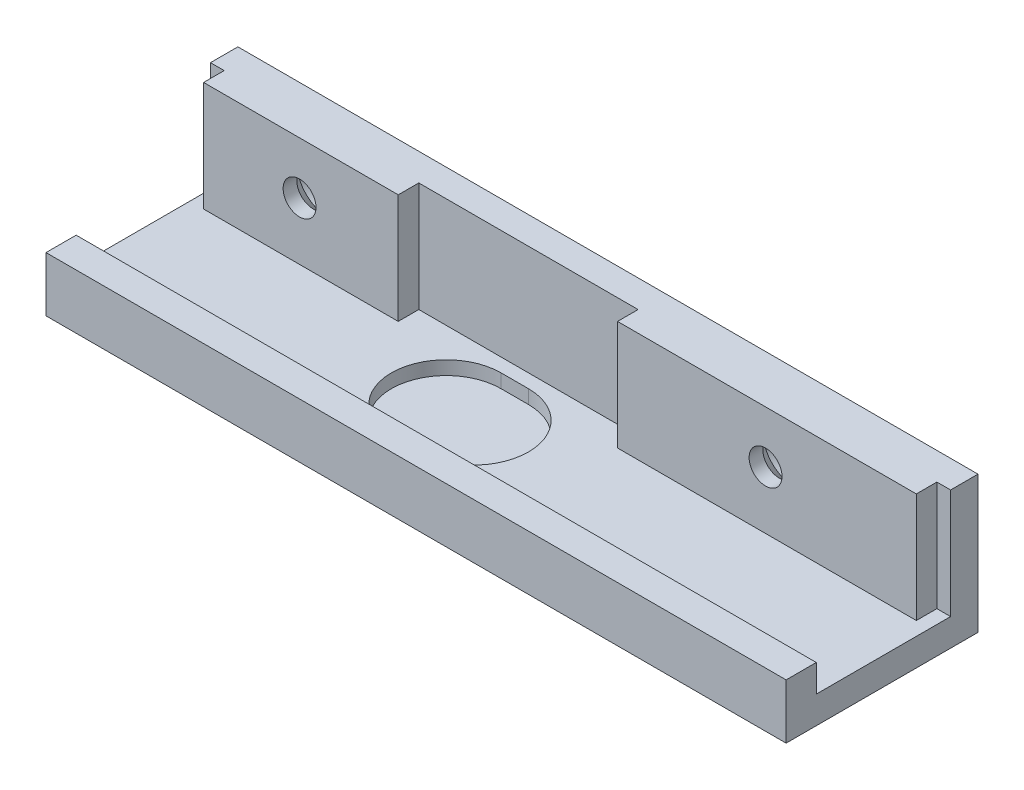
ISO-10303-21;
HEADER;
FILE_DESCRIPTION(('STEP AP214'),'2;1');
FILE_NAME('part.step','',(''),(''),'','','');
FILE_SCHEMA(('AUTOMOTIVE_DESIGN { 1 0 10303 214 1 1 1 1 }'));
ENDSEC;
DATA;
#1=APPLICATION_CONTEXT('core data for automotive mechanical design processes');
#2=APPLICATION_PROTOCOL_DEFINITION('international standard','automotive_design',2000,#1);
#3=PRODUCT_CONTEXT('',#1,'mechanical');
#4=PRODUCT('Part','Part','',(#3));
#5=PRODUCT_RELATED_PRODUCT_CATEGORY('part','',(#4));
#6=PRODUCT_DEFINITION_FORMATION('','',#4);
#7=PRODUCT_DEFINITION_CONTEXT('part definition',#1,'design');
#8=PRODUCT_DEFINITION('design','',#6,#7);
#9=PRODUCT_DEFINITION_SHAPE('','',#8);
#10=(LENGTH_UNIT() NAMED_UNIT(*) SI_UNIT(.MILLI.,.METRE.));
#11=(NAMED_UNIT(*) PLANE_ANGLE_UNIT() SI_UNIT($,.RADIAN.));
#12=(NAMED_UNIT(*) SI_UNIT($,.STERADIAN.) SOLID_ANGLE_UNIT());
#13=UNCERTAINTY_MEASURE_WITH_UNIT(LENGTH_MEASURE(1.E-05),#10,'distance_accuracy_value','');
#14=(GEOMETRIC_REPRESENTATION_CONTEXT(3) GLOBAL_UNCERTAINTY_ASSIGNED_CONTEXT((#13)) GLOBAL_UNIT_ASSIGNED_CONTEXT((#10,
#11,#12)) REPRESENTATION_CONTEXT('',''));
#15=CARTESIAN_POINT('',(0.,0.,0.));
#16=DIRECTION('',(0.,0.,1.));
#17=DIRECTION('',(1.,0.,0.));
#18=AXIS2_PLACEMENT_3D('',#15,#16,#17);
#19=CARTESIAN_POINT('',(0.,2.54,0.));
#20=DIRECTION('',(0.,1.,0.));
#21=DIRECTION('',(0.,0.,1.));
#22=AXIS2_PLACEMENT_3D('',#19,#20,#21);
#23=PLANE('',#22);
#24=DIRECTION('',(-1.,0.,0.));
#25=VECTOR('',#24,1.);
#26=CARTESIAN_POINT('',(0.,2.54,14.986));
#27=LINE('',#26,#25);
#28=CARTESIAN_POINT('',(68.58,2.54,14.986));
#29=VERTEX_POINT('',#28);
#30=CARTESIAN_POINT('',(0.,2.54,14.986));
#31=VERTEX_POINT('',#30);
#32=EDGE_CURVE('E197',#29,#31,#27,.T.);
#33=ORIENTED_EDGE('',*,*,#32,.F.);
#34=DIRECTION('',(0.,0.,-1.));
#35=VECTOR('',#34,1.);
#36=CARTESIAN_POINT('',(68.58,2.54,0.));
#37=LINE('',#36,#35);
#38=CARTESIAN_POINT('',(68.58,2.54,2.54));
#39=VERTEX_POINT('',#38);
#40=EDGE_CURVE('E329',#29,#39,#37,.T.);
#41=ORIENTED_EDGE('',*,*,#40,.T.);
#42=DIRECTION('',(1.,0.,0.));
#43=VECTOR('',#42,1.);
#44=CARTESIAN_POINT('',(67.31,2.54,2.54));
#45=LINE('',#44,#43);
#46=CARTESIAN_POINT('',(67.31,2.54,2.54));
#47=VERTEX_POINT('',#46);
#48=EDGE_CURVE('E56',#47,#39,#45,.T.);
#49=ORIENTED_EDGE('',*,*,#48,.F.);
#50=DIRECTION('',(0.,0.,1.));
#51=VECTOR('',#50,1.);
#52=CARTESIAN_POINT('',(67.31,2.54,2.54));
#53=LINE('',#52,#51);
#54=CARTESIAN_POINT('',(67.31,2.54,4.445));
#55=VERTEX_POINT('',#54);
#56=EDGE_CURVE('E284',#47,#55,#53,.T.);
#57=ORIENTED_EDGE('',*,*,#56,.T.);
#58=DIRECTION('',(1.,0.,0.));
#59=VECTOR('',#58,1.);
#60=CARTESIAN_POINT('',(39.624,2.54,4.445));
#61=LINE('',#60,#59);
#62=CARTESIAN_POINT('',(39.624,2.54,4.445));
#63=VERTEX_POINT('',#62);
#64=EDGE_CURVE('E281',#63,#55,#61,.T.);
#65=ORIENTED_EDGE('',*,*,#64,.F.);
#66=DIRECTION('',(0.,0.,1.));
#67=VECTOR('',#66,1.);
#68=CARTESIAN_POINT('',(39.624,2.54,2.54));
#69=LINE('',#68,#67);
#70=CARTESIAN_POINT('',(39.624,2.54,2.54));
#71=VERTEX_POINT('',#70);
#72=EDGE_CURVE('E278',#71,#63,#69,.T.);
#73=ORIENTED_EDGE('',*,*,#72,.F.);
#74=DIRECTION('',(1.,0.,0.));
#75=VECTOR('',#74,1.);
#76=CARTESIAN_POINT('',(19.304,2.54,2.54));
#77=LINE('',#76,#75);
#78=CARTESIAN_POINT('',(19.304,2.54,2.54));
#79=VERTEX_POINT('',#78);
#80=EDGE_CURVE('E244',#79,#71,#77,.T.);
#81=ORIENTED_EDGE('',*,*,#80,.F.);
#82=DIRECTION('',(0.,0.,1.));
#83=VECTOR('',#82,1.);
#84=CARTESIAN_POINT('',(19.304,2.54,2.54));
#85=LINE('',#84,#83);
#86=CARTESIAN_POINT('',(19.304,2.54,4.445));
#87=VERTEX_POINT('',#86);
#88=EDGE_CURVE('E249',#79,#87,#85,.T.);
#89=ORIENTED_EDGE('',*,*,#88,.T.);
#90=DIRECTION('',(1.,0.,0.));
#91=VECTOR('',#90,1.);
#92=CARTESIAN_POINT('',(1.27,2.54,4.445));
#93=LINE('',#92,#91);
#94=CARTESIAN_POINT('',(1.27,2.54,4.445));
#95=VERTEX_POINT('',#94);
#96=EDGE_CURVE('E293',#95,#87,#93,.T.);
#97=ORIENTED_EDGE('',*,*,#96,.F.);
#98=DIRECTION('',(0.,0.,1.));
#99=VECTOR('',#98,1.);
#100=CARTESIAN_POINT('',(1.27,2.54,2.54));
#101=LINE('',#100,#99);
#102=CARTESIAN_POINT('',(1.27,2.54,2.54));
#103=VERTEX_POINT('',#102);
#104=EDGE_CURVE('E290',#103,#95,#101,.T.);
#105=ORIENTED_EDGE('',*,*,#104,.F.);
#106=DIRECTION('',(1.,0.,0.));
#107=VECTOR('',#106,1.);
#108=CARTESIAN_POINT('',(0.,2.54,2.54));
#109=LINE('',#108,#107);
#110=CARTESIAN_POINT('',(0.,2.54,2.54));
#111=VERTEX_POINT('',#110);
#112=EDGE_CURVE('E287',#111,#103,#109,.T.);
#113=ORIENTED_EDGE('',*,*,#112,.F.);
#114=DIRECTION('',(0.,0.,1.));
#115=VECTOR('',#114,1.);
#116=CARTESIAN_POINT('',(0.,2.54,0.));
#117=LINE('',#116,#115);
#118=EDGE_CURVE('E327',#111,#31,#117,.T.);
#119=ORIENTED_EDGE('',*,*,#118,.T.);
#120=EDGE_LOOP('',(#33,#41,#49,#57,#65,#73,#81,#89,#97,#105,#113,#119));
#121=FACE_BOUND('',#120,.T.);
#122=CARTESIAN_POINT('',(28.194,2.54,8.89));
#123=DIRECTION('',(0.,1.,0.));
#124=DIRECTION('',(0.,0.,1.));
#125=AXIS2_PLACEMENT_3D('',#122,#123,#124);
#126=CIRCLE('',#125,5.08);
#127=CARTESIAN_POINT('',(28.194,2.54,3.81));
#128=VERTEX_POINT('',#127);
#129=CARTESIAN_POINT('',(28.194,2.54,13.97));
#130=VERTEX_POINT('',#129);
#131=EDGE_CURVE('E48',#128,#130,#126,.T.);
#132=ORIENTED_EDGE('',*,*,#131,.F.);
#133=DIRECTION('',(-1.,0.,0.));
#134=VECTOR('',#133,1.);
#135=CARTESIAN_POINT('',(28.194,2.54,3.81));
#136=LINE('',#135,#134);
#137=CARTESIAN_POINT('',(30.734,2.54,3.81));
#138=VERTEX_POINT('',#137);
#139=EDGE_CURVE('E206',#138,#128,#136,.T.);
#140=ORIENTED_EDGE('',*,*,#139,.F.);
#141=CARTESIAN_POINT('',(30.734,2.54,8.89));
#142=DIRECTION('',(0.,1.,0.));
#143=DIRECTION('',(0.,0.,1.));
#144=AXIS2_PLACEMENT_3D('',#141,#142,#143);
#145=CIRCLE('',#144,5.08);
#146=CARTESIAN_POINT('',(30.734,2.54,13.97));
#147=VERTEX_POINT('',#146);
#148=EDGE_CURVE('E220',#147,#138,#145,.T.);
#149=ORIENTED_EDGE('',*,*,#148,.F.);
#150=DIRECTION('',(1.,0.,0.));
#151=VECTOR('',#150,1.);
#152=CARTESIAN_POINT('',(28.194,2.54,13.97));
#153=LINE('',#152,#151);
#154=EDGE_CURVE('E217',#130,#147,#153,.T.);
#155=ORIENTED_EDGE('',*,*,#154,.F.);
#156=EDGE_LOOP('',(#132,#140,#149,#155));
#157=FACE_BOUND('',#156,.T.);
#158=ADVANCED_FACE('F33',(#121,#157),#23,.T.);
#159=CARTESIAN_POINT('',(0.,2.54,0.));
#160=DIRECTION('',(1.,0.,0.));
#161=DIRECTION('',(0.,0.,-1.));
#162=AXIS2_PLACEMENT_3D('',#159,#160,#161);
#163=PLANE('',#162);
#164=DIRECTION('',(0.,0.,1.));
#165=VECTOR('',#164,1.);
#166=CARTESIAN_POINT('',(0.,0.,0.));
#167=LINE('',#166,#165);
#168=CARTESIAN_POINT('',(0.,0.,0.));
#169=VERTEX_POINT('',#168);
#170=CARTESIAN_POINT('',(0.,0.,17.78));
#171=VERTEX_POINT('',#170);
#172=EDGE_CURVE('E326',#169,#171,#167,.T.);
#173=ORIENTED_EDGE('',*,*,#172,.T.);
#174=DIRECTION('',(0.,-1.,0.));
#175=VECTOR('',#174,1.);
#176=CARTESIAN_POINT('',(0.,2.54,17.78));
#177=LINE('',#176,#175);
#178=CARTESIAN_POINT('',(0.,5.08,17.78));
#179=VERTEX_POINT('',#178);
#180=EDGE_CURVE('E179',#179,#171,#177,.T.);
#181=ORIENTED_EDGE('',*,*,#180,.F.);
#182=DIRECTION('',(0.,0.,1.));
#183=VECTOR('',#182,1.);
#184=CARTESIAN_POINT('',(0.,5.08,17.78));
#185=LINE('',#184,#183);
#186=CARTESIAN_POINT('',(0.,5.08,14.986));
#187=VERTEX_POINT('',#186);
#188=EDGE_CURVE('E170',#187,#179,#185,.T.);
#189=ORIENTED_EDGE('',*,*,#188,.F.);
#190=DIRECTION('',(0.,1.,0.));
#191=VECTOR('',#190,1.);
#192=CARTESIAN_POINT('',(0.,2.54,14.986));
#193=LINE('',#192,#191);
#194=EDGE_CURVE('E176',#31,#187,#193,.T.);
#195=ORIENTED_EDGE('',*,*,#194,.F.);
#196=ORIENTED_EDGE('',*,*,#118,.F.);
#197=DIRECTION('',(0.,-1.,0.));
#198=VECTOR('',#197,1.);
#199=CARTESIAN_POINT('',(0.,12.7,2.54));
#200=LINE('',#199,#198);
#201=CARTESIAN_POINT('',(0.,12.7,2.54));
#202=VERTEX_POINT('',#201);
#203=EDGE_CURVE('E308',#202,#111,#200,.T.);
#204=ORIENTED_EDGE('',*,*,#203,.F.);
#205=DIRECTION('',(0.,0.,1.));
#206=VECTOR('',#205,1.);
#207=CARTESIAN_POINT('',(0.,12.7,0.));
#208=LINE('',#207,#206);
#209=CARTESIAN_POINT('',(0.,12.7,0.));
#210=VERTEX_POINT('',#209);
#211=EDGE_CURVE('E264',#210,#202,#208,.T.);
#212=ORIENTED_EDGE('',*,*,#211,.F.);
#213=DIRECTION('',(0.,-1.,0.));
#214=VECTOR('',#213,1.);
#215=CARTESIAN_POINT('',(0.,2.54,0.));
#216=LINE('',#215,#214);
#217=EDGE_CURVE('E332',#210,#169,#216,.T.);
#218=ORIENTED_EDGE('',*,*,#217,.T.);
#219=EDGE_LOOP('',(#173,#181,#189,#195,#196,#204,#212,#218));
#220=FACE_BOUND('',#219,.T.);
#221=ADVANCED_FACE('F173',(#220),#163,.F.);
#222=CARTESIAN_POINT('',(0.,2.54,17.78));
#223=DIRECTION('',(0.,0.,-1.));
#224=DIRECTION('',(-1.,0.,0.));
#225=AXIS2_PLACEMENT_3D('',#222,#223,#224);
#226=PLANE('',#225);
#227=DIRECTION('',(1.,0.,0.));
#228=VECTOR('',#227,1.);
#229=CARTESIAN_POINT('',(0.,0.,17.78));
#230=LINE('',#229,#228);
#231=CARTESIAN_POINT('',(68.58,0.,17.78));
#232=VERTEX_POINT('',#231);
#233=EDGE_CURVE('E334',#171,#232,#230,.T.);
#234=ORIENTED_EDGE('',*,*,#233,.T.);
#235=DIRECTION('',(0.,-1.,0.));
#236=VECTOR('',#235,1.);
#237=CARTESIAN_POINT('',(68.58,2.54,17.78));
#238=LINE('',#237,#236);
#239=CARTESIAN_POINT('',(68.58,5.08,17.78));
#240=VERTEX_POINT('',#239);
#241=EDGE_CURVE('E344',#240,#232,#238,.T.);
#242=ORIENTED_EDGE('',*,*,#241,.F.);
#243=DIRECTION('',(1.,0.,0.));
#244=VECTOR('',#243,1.);
#245=CARTESIAN_POINT('',(0.,5.08,17.78));
#246=LINE('',#245,#244);
#247=EDGE_CURVE('E183',#179,#240,#246,.T.);
#248=ORIENTED_EDGE('',*,*,#247,.F.);
#249=ORIENTED_EDGE('',*,*,#180,.T.);
#250=EDGE_LOOP('',(#234,#242,#248,#249));
#251=FACE_BOUND('',#250,.T.);
#252=ADVANCED_FACE('F427',(#251),#226,.F.);
#253=CARTESIAN_POINT('',(68.58,2.54,0.));
#254=DIRECTION('',(-1.,0.,0.));
#255=DIRECTION('',(0.,0.,1.));
#256=AXIS2_PLACEMENT_3D('',#253,#254,#255);
#257=PLANE('',#256);
#258=ORIENTED_EDGE('',*,*,#40,.F.);
#259=DIRECTION('',(0.,-1.,0.));
#260=VECTOR('',#259,1.);
#261=CARTESIAN_POINT('',(68.58,2.54,14.986));
#262=LINE('',#261,#260);
#263=CARTESIAN_POINT('',(68.58,5.08,14.986));
#264=VERTEX_POINT('',#263);
#265=EDGE_CURVE('E193',#264,#29,#262,.T.);
#266=ORIENTED_EDGE('',*,*,#265,.F.);
#267=DIRECTION('',(0.,0.,-1.));
#268=VECTOR('',#267,1.);
#269=CARTESIAN_POINT('',(68.58,5.08,17.78));
#270=LINE('',#269,#268);
#271=EDGE_CURVE('E190',#240,#264,#270,.T.);
#272=ORIENTED_EDGE('',*,*,#271,.F.);
#273=ORIENTED_EDGE('',*,*,#241,.T.);
#274=DIRECTION('',(0.,0.,-1.));
#275=VECTOR('',#274,1.);
#276=CARTESIAN_POINT('',(68.58,0.,0.));
#277=LINE('',#276,#275);
#278=CARTESIAN_POINT('',(68.58,0.,0.));
#279=VERTEX_POINT('',#278);
#280=EDGE_CURVE('E336',#232,#279,#277,.T.);
#281=ORIENTED_EDGE('',*,*,#280,.T.);
#282=DIRECTION('',(0.,-1.,0.));
#283=VECTOR('',#282,1.);
#284=CARTESIAN_POINT('',(68.58,2.54,0.));
#285=LINE('',#284,#283);
#286=CARTESIAN_POINT('',(68.58,12.7,0.));
#287=VERTEX_POINT('',#286);
#288=EDGE_CURVE('E341',#287,#279,#285,.T.);
#289=ORIENTED_EDGE('',*,*,#288,.F.);
#290=DIRECTION('',(0.,0.,1.));
#291=VECTOR('',#290,1.);
#292=CARTESIAN_POINT('',(68.58,12.7,0.));
#293=LINE('',#292,#291);
#294=CARTESIAN_POINT('',(68.58,12.7,2.54));
#295=VERTEX_POINT('',#294);
#296=EDGE_CURVE('E258',#287,#295,#293,.T.);
#297=ORIENTED_EDGE('',*,*,#296,.T.);
#298=DIRECTION('',(0.,-1.,0.));
#299=VECTOR('',#298,1.);
#300=CARTESIAN_POINT('',(68.58,12.7,2.54));
#301=LINE('',#300,#299);
#302=EDGE_CURVE('E311',#295,#39,#301,.T.);
#303=ORIENTED_EDGE('',*,*,#302,.T.);
#304=EDGE_LOOP('',(#258,#266,#272,#273,#281,#289,#297,#303));
#305=FACE_BOUND('',#304,.T.);
#306=ADVANCED_FACE('F409',(#305),#257,.F.);
#307=CARTESIAN_POINT('',(0.,2.54,0.));
#308=DIRECTION('',(0.,0.,1.));
#309=DIRECTION('',(1.,0.,0.));
#310=AXIS2_PLACEMENT_3D('',#307,#308,#309);
#311=PLANE('',#310);
#312=CARTESIAN_POINT('',(53.34,7.874,0.));
#313=DIRECTION('',(0.,0.,1.));
#314=DIRECTION('',(1.,0.,0.));
#315=AXIS2_PLACEMENT_3D('',#312,#313,#314);
#316=CIRCLE('',#315,2.921);
#317=CARTESIAN_POINT('',(56.261,7.874,0.));
#318=VERTEX_POINT('',#317);
#319=EDGE_CURVE('E227',#318,#318,#316,.T.);
#320=ORIENTED_EDGE('',*,*,#319,.T.);
#321=EDGE_LOOP('',(#320));
#322=FACE_BOUND('',#321,.T.);
#323=CARTESIAN_POINT('',(10.16,7.874,0.));
#324=DIRECTION('',(0.,0.,1.));
#325=DIRECTION('',(1.,0.,0.));
#326=AXIS2_PLACEMENT_3D('',#323,#324,#325);
#327=CIRCLE('',#326,2.921);
#328=CARTESIAN_POINT('',(13.081,7.874,0.));
#329=VERTEX_POINT('',#328);
#330=EDGE_CURVE('E235',#329,#329,#327,.T.);
#331=ORIENTED_EDGE('',*,*,#330,.T.);
#332=EDGE_LOOP('',(#331));
#333=FACE_BOUND('',#332,.T.);
#334=DIRECTION('',(-1.,0.,0.));
#335=VECTOR('',#334,1.);
#336=CARTESIAN_POINT('',(0.,0.,0.));
#337=LINE('',#336,#335);
#338=EDGE_CURVE('E330',#279,#169,#337,.T.);
#339=ORIENTED_EDGE('',*,*,#338,.T.);
#340=ORIENTED_EDGE('',*,*,#217,.F.);
#341=DIRECTION('',(1.,0.,0.));
#342=VECTOR('',#341,1.);
#343=CARTESIAN_POINT('',(0.,12.7,0.));
#344=LINE('',#343,#342);
#345=EDGE_CURVE('E261',#210,#287,#344,.T.);
#346=ORIENTED_EDGE('',*,*,#345,.T.);
#347=ORIENTED_EDGE('',*,*,#288,.T.);
#348=EDGE_LOOP('',(#339,#340,#346,#347));
#349=FACE_BOUND('',#348,.T.);
#350=ADVANCED_FACE('F420',(#322,#333,#349),#311,.F.);
#351=CARTESIAN_POINT('',(0.,0.,0.));
#352=DIRECTION('',(0.,1.,0.));
#353=DIRECTION('',(0.,0.,1.));
#354=AXIS2_PLACEMENT_3D('',#351,#352,#353);
#355=PLANE('',#354);
#356=ORIENTED_EDGE('',*,*,#172,.F.);
#357=ORIENTED_EDGE('',*,*,#338,.F.);
#358=ORIENTED_EDGE('',*,*,#280,.F.);
#359=ORIENTED_EDGE('',*,*,#233,.F.);
#360=EDGE_LOOP('',(#356,#357,#358,#359));
#361=FACE_BOUND('',#360,.T.);
#362=ADVANCED_FACE('F424',(#361),#355,.F.);
#363=CARTESIAN_POINT('',(0.,5.08,0.));
#364=DIRECTION('',(0.,-1.,0.));
#365=DIRECTION('',(0.,0.,-1.));
#366=AXIS2_PLACEMENT_3D('',#363,#364,#365);
#367=PLANE('',#366);
#368=ORIENTED_EDGE('',*,*,#188,.T.);
#369=ORIENTED_EDGE('',*,*,#247,.T.);
#370=ORIENTED_EDGE('',*,*,#271,.T.);
#371=DIRECTION('',(1.,0.,0.));
#372=VECTOR('',#371,1.);
#373=CARTESIAN_POINT('',(0.,5.08,14.986));
#374=LINE('',#373,#372);
#375=EDGE_CURVE('E187',#187,#264,#374,.T.);
#376=ORIENTED_EDGE('',*,*,#375,.F.);
#377=EDGE_LOOP('',(#368,#369,#370,#376));
#378=FACE_BOUND('',#377,.T.);
#379=ADVANCED_FACE('F188',(#378),#367,.F.);
#380=CARTESIAN_POINT('',(19.304,12.7,2.54));
#381=DIRECTION('',(0.,0.,-1.));
#382=DIRECTION('',(-1.,0.,0.));
#383=AXIS2_PLACEMENT_3D('',#380,#381,#382);
#384=PLANE('',#383);
#385=ORIENTED_EDGE('',*,*,#80,.T.);
#386=DIRECTION('',(0.,-1.,0.));
#387=VECTOR('',#386,1.);
#388=CARTESIAN_POINT('',(39.624,12.7,2.54));
#389=LINE('',#388,#387);
#390=CARTESIAN_POINT('',(39.624,12.7,2.54));
#391=VERTEX_POINT('',#390);
#392=EDGE_CURVE('E184',#391,#71,#389,.T.);
#393=ORIENTED_EDGE('',*,*,#392,.F.);
#394=DIRECTION('',(1.,0.,0.));
#395=VECTOR('',#394,1.);
#396=CARTESIAN_POINT('',(19.304,12.7,2.54));
#397=LINE('',#396,#395);
#398=CARTESIAN_POINT('',(19.304,12.7,2.54));
#399=VERTEX_POINT('',#398);
#400=EDGE_CURVE('E245',#399,#391,#397,.T.);
#401=ORIENTED_EDGE('',*,*,#400,.F.);
#402=DIRECTION('',(0.,-1.,0.));
#403=VECTOR('',#402,1.);
#404=CARTESIAN_POINT('',(19.304,12.7,2.54));
#405=LINE('',#404,#403);
#406=EDGE_CURVE('E275',#399,#79,#405,.T.);
#407=ORIENTED_EDGE('',*,*,#406,.T.);
#408=EDGE_LOOP('',(#385,#393,#401,#407));
#409=FACE_BOUND('',#408,.T.);
#410=ADVANCED_FACE('F387',(#409),#384,.F.);
#411=CARTESIAN_POINT('',(39.624,12.7,2.54));
#412=DIRECTION('',(1.,0.,0.));
#413=DIRECTION('',(0.,0.,-1.));
#414=AXIS2_PLACEMENT_3D('',#411,#412,#413);
#415=PLANE('',#414);
#416=ORIENTED_EDGE('',*,*,#72,.T.);
#417=DIRECTION('',(0.,-1.,0.));
#418=VECTOR('',#417,1.);
#419=CARTESIAN_POINT('',(39.624,12.7,4.445));
#420=LINE('',#419,#418);
#421=CARTESIAN_POINT('',(39.624,12.7,4.445));
#422=VERTEX_POINT('',#421);
#423=EDGE_CURVE('E319',#422,#63,#420,.T.);
#424=ORIENTED_EDGE('',*,*,#423,.F.);
#425=DIRECTION('',(0.,0.,1.));
#426=VECTOR('',#425,1.);
#427=CARTESIAN_POINT('',(39.624,12.7,2.54));
#428=LINE('',#427,#426);
#429=EDGE_CURVE('E248',#391,#422,#428,.T.);
#430=ORIENTED_EDGE('',*,*,#429,.F.);
#431=ORIENTED_EDGE('',*,*,#392,.T.);
#432=EDGE_LOOP('',(#416,#424,#430,#431));
#433=FACE_BOUND('',#432,.T.);
#434=ADVANCED_FACE('F376',(#433),#415,.F.);
#435=CARTESIAN_POINT('',(39.624,12.7,4.445));
#436=DIRECTION('',(0.,0.,-1.));
#437=DIRECTION('',(-1.,0.,0.));
#438=AXIS2_PLACEMENT_3D('',#435,#436,#437);
#439=PLANE('',#438);
#440=CARTESIAN_POINT('',(53.34,7.874,4.445));
#441=DIRECTION('',(0.,0.,1.));
#442=DIRECTION('',(1.,0.,0.));
#443=AXIS2_PLACEMENT_3D('',#440,#441,#442);
#444=CIRCLE('',#443,1.524);
#445=CARTESIAN_POINT('',(54.864,7.874,4.445));
#446=VERTEX_POINT('',#445);
#447=EDGE_CURVE('E238',#446,#446,#444,.T.);
#448=ORIENTED_EDGE('',*,*,#447,.F.);
#449=EDGE_LOOP('',(#448));
#450=FACE_BOUND('',#449,.T.);
#451=ORIENTED_EDGE('',*,*,#64,.T.);
#452=DIRECTION('',(0.,-1.,0.));
#453=VECTOR('',#452,1.);
#454=CARTESIAN_POINT('',(67.31,12.7,4.445));
#455=LINE('',#454,#453);
#456=CARTESIAN_POINT('',(67.31,12.7,4.445));
#457=VERTEX_POINT('',#456);
#458=EDGE_CURVE('E316',#457,#55,#455,.T.);
#459=ORIENTED_EDGE('',*,*,#458,.F.);
#460=DIRECTION('',(1.,0.,0.));
#461=VECTOR('',#460,1.);
#462=CARTESIAN_POINT('',(39.624,12.7,4.445));
#463=LINE('',#462,#461);
#464=EDGE_CURVE('E251',#422,#457,#463,.T.);
#465=ORIENTED_EDGE('',*,*,#464,.F.);
#466=ORIENTED_EDGE('',*,*,#423,.T.);
#467=EDGE_LOOP('',(#451,#459,#465,#466));
#468=FACE_BOUND('',#467,.T.);
#469=ADVANCED_FACE('F372',(#450,#468),#439,.F.);
#470=CARTESIAN_POINT('',(67.31,12.7,2.54));
#471=DIRECTION('',(1.,0.,0.));
#472=DIRECTION('',(0.,0.,-1.));
#473=AXIS2_PLACEMENT_3D('',#470,#471,#472);
#474=PLANE('',#473);
#475=ORIENTED_EDGE('',*,*,#56,.F.);
#476=DIRECTION('',(0.,-1.,0.));
#477=VECTOR('',#476,1.);
#478=CARTESIAN_POINT('',(67.31,12.7,2.54));
#479=LINE('',#478,#477);
#480=CARTESIAN_POINT('',(67.31,12.7,2.54));
#481=VERTEX_POINT('',#480);
#482=EDGE_CURVE('E314',#481,#47,#479,.T.);
#483=ORIENTED_EDGE('',*,*,#482,.F.);
#484=DIRECTION('',(0.,0.,1.));
#485=VECTOR('',#484,1.);
#486=CARTESIAN_POINT('',(67.31,12.7,2.54));
#487=LINE('',#486,#485);
#488=EDGE_CURVE('E253',#481,#457,#487,.T.);
#489=ORIENTED_EDGE('',*,*,#488,.T.);
#490=ORIENTED_EDGE('',*,*,#458,.T.);
#491=EDGE_LOOP('',(#475,#483,#489,#490));
#492=FACE_BOUND('',#491,.T.);
#493=ADVANCED_FACE('F375',(#492),#474,.T.);
#494=CARTESIAN_POINT('',(67.31,12.7,2.54));
#495=DIRECTION('',(0.,0.,-1.));
#496=DIRECTION('',(-1.,0.,0.));
#497=AXIS2_PLACEMENT_3D('',#494,#495,#496);
#498=PLANE('',#497);
#499=ORIENTED_EDGE('',*,*,#48,.T.);
#500=ORIENTED_EDGE('',*,*,#302,.F.);
#501=DIRECTION('',(1.,0.,0.));
#502=VECTOR('',#501,1.);
#503=CARTESIAN_POINT('',(67.31,12.7,2.54));
#504=LINE('',#503,#502);
#505=EDGE_CURVE('E256',#481,#295,#504,.T.);
#506=ORIENTED_EDGE('',*,*,#505,.F.);
#507=ORIENTED_EDGE('',*,*,#482,.T.);
#508=EDGE_LOOP('',(#499,#500,#506,#507));
#509=FACE_BOUND('',#508,.T.);
#510=ADVANCED_FACE('F414',(#509),#498,.F.);
#511=CARTESIAN_POINT('',(0.,12.7,2.54));
#512=DIRECTION('',(0.,0.,-1.));
#513=DIRECTION('',(-1.,0.,0.));
#514=AXIS2_PLACEMENT_3D('',#511,#512,#513);
#515=PLANE('',#514);
#516=ORIENTED_EDGE('',*,*,#112,.T.);
#517=DIRECTION('',(0.,-1.,0.));
#518=VECTOR('',#517,1.);
#519=CARTESIAN_POINT('',(1.27,12.7,2.54));
#520=LINE('',#519,#518);
#521=CARTESIAN_POINT('',(1.27,12.7,2.54));
#522=VERTEX_POINT('',#521);
#523=EDGE_CURVE('E305',#522,#103,#520,.T.);
#524=ORIENTED_EDGE('',*,*,#523,.F.);
#525=DIRECTION('',(1.,0.,0.));
#526=VECTOR('',#525,1.);
#527=CARTESIAN_POINT('',(0.,12.7,2.54));
#528=LINE('',#527,#526);
#529=EDGE_CURVE('E266',#202,#522,#528,.T.);
#530=ORIENTED_EDGE('',*,*,#529,.F.);
#531=ORIENTED_EDGE('',*,*,#203,.T.);
#532=EDGE_LOOP('',(#516,#524,#530,#531));
#533=FACE_BOUND('',#532,.T.);
#534=ADVANCED_FACE('F402',(#533),#515,.F.);
#535=CARTESIAN_POINT('',(1.27,12.7,2.54));
#536=DIRECTION('',(1.,0.,0.));
#537=DIRECTION('',(0.,0.,-1.));
#538=AXIS2_PLACEMENT_3D('',#535,#536,#537);
#539=PLANE('',#538);
#540=ORIENTED_EDGE('',*,*,#104,.T.);
#541=DIRECTION('',(0.,-1.,0.));
#542=VECTOR('',#541,1.);
#543=CARTESIAN_POINT('',(1.27,12.7,4.445));
#544=LINE('',#543,#542);
#545=CARTESIAN_POINT('',(1.27,12.7,4.445));
#546=VERTEX_POINT('',#545);
#547=EDGE_CURVE('E302',#546,#95,#544,.T.);
#548=ORIENTED_EDGE('',*,*,#547,.F.);
#549=DIRECTION('',(0.,0.,1.));
#550=VECTOR('',#549,1.);
#551=CARTESIAN_POINT('',(1.27,12.7,2.54));
#552=LINE('',#551,#550);
#553=EDGE_CURVE('E268',#522,#546,#552,.T.);
#554=ORIENTED_EDGE('',*,*,#553,.F.);
#555=ORIENTED_EDGE('',*,*,#523,.T.);
#556=EDGE_LOOP('',(#540,#548,#554,#555));
#557=FACE_BOUND('',#556,.T.);
#558=ADVANCED_FACE('F399',(#557),#539,.F.);
#559=CARTESIAN_POINT('',(1.27,12.7,4.445));
#560=DIRECTION('',(0.,0.,-1.));
#561=DIRECTION('',(-1.,0.,0.));
#562=AXIS2_PLACEMENT_3D('',#559,#560,#561);
#563=PLANE('',#562);
#564=CARTESIAN_POINT('',(10.16,7.874,4.445));
#565=DIRECTION('',(0.,0.,1.));
#566=DIRECTION('',(1.,0.,0.));
#567=AXIS2_PLACEMENT_3D('',#564,#565,#566);
#568=CIRCLE('',#567,1.524);
#569=CARTESIAN_POINT('',(11.684,7.874,4.445));
#570=VERTEX_POINT('',#569);
#571=EDGE_CURVE('E241',#570,#570,#568,.T.);
#572=ORIENTED_EDGE('',*,*,#571,.F.);
#573=EDGE_LOOP('',(#572));
#574=FACE_BOUND('',#573,.T.);
#575=ORIENTED_EDGE('',*,*,#96,.T.);
#576=DIRECTION('',(0.,-1.,0.));
#577=VECTOR('',#576,1.);
#578=CARTESIAN_POINT('',(19.304,12.7,4.445));
#579=LINE('',#578,#577);
#580=CARTESIAN_POINT('',(19.304,12.7,4.445));
#581=VERTEX_POINT('',#580);
#582=EDGE_CURVE('E299',#581,#87,#579,.T.);
#583=ORIENTED_EDGE('',*,*,#582,.F.);
#584=DIRECTION('',(1.,0.,0.));
#585=VECTOR('',#584,1.);
#586=CARTESIAN_POINT('',(1.27,12.7,4.445));
#587=LINE('',#586,#585);
#588=EDGE_CURVE('E270',#546,#581,#587,.T.);
#589=ORIENTED_EDGE('',*,*,#588,.F.);
#590=ORIENTED_EDGE('',*,*,#547,.T.);
#591=EDGE_LOOP('',(#575,#583,#589,#590));
#592=FACE_BOUND('',#591,.T.);
#593=ADVANCED_FACE('F395',(#574,#592),#563,.F.);
#594=CARTESIAN_POINT('',(19.304,12.7,2.54));
#595=DIRECTION('',(1.,0.,0.));
#596=DIRECTION('',(0.,0.,-1.));
#597=AXIS2_PLACEMENT_3D('',#594,#595,#596);
#598=PLANE('',#597);
#599=ORIENTED_EDGE('',*,*,#88,.F.);
#600=ORIENTED_EDGE('',*,*,#406,.F.);
#601=DIRECTION('',(0.,0.,1.));
#602=VECTOR('',#601,1.);
#603=CARTESIAN_POINT('',(19.304,12.7,2.54));
#604=LINE('',#603,#602);
#605=EDGE_CURVE('E272',#399,#581,#604,.T.);
#606=ORIENTED_EDGE('',*,*,#605,.T.);
#607=ORIENTED_EDGE('',*,*,#582,.T.);
#608=EDGE_LOOP('',(#599,#600,#606,#607));
#609=FACE_BOUND('',#608,.T.);
#610=ADVANCED_FACE('F391',(#609),#598,.T.);
#611=CARTESIAN_POINT('',(0.,12.7,0.));
#612=DIRECTION('',(0.,-1.,0.));
#613=DIRECTION('',(0.,0.,-1.));
#614=AXIS2_PLACEMENT_3D('',#611,#612,#613);
#615=PLANE('',#614);
#616=ORIENTED_EDGE('',*,*,#400,.T.);
#617=ORIENTED_EDGE('',*,*,#429,.T.);
#618=ORIENTED_EDGE('',*,*,#464,.T.);
#619=ORIENTED_EDGE('',*,*,#488,.F.);
#620=ORIENTED_EDGE('',*,*,#505,.T.);
#621=ORIENTED_EDGE('',*,*,#296,.F.);
#622=ORIENTED_EDGE('',*,*,#345,.F.);
#623=ORIENTED_EDGE('',*,*,#211,.T.);
#624=ORIENTED_EDGE('',*,*,#529,.T.);
#625=ORIENTED_EDGE('',*,*,#553,.T.);
#626=ORIENTED_EDGE('',*,*,#588,.T.);
#627=ORIENTED_EDGE('',*,*,#605,.F.);
#628=EDGE_LOOP('',(#616,#617,#618,#619,#620,#621,#622,#623,#624,#625,#626,#627));
#629=FACE_BOUND('',#628,.T.);
#630=ADVANCED_FACE('F418',(#629),#615,.F.);
#631=CARTESIAN_POINT('',(10.16,7.874,0.));
#632=DIRECTION('',(0.,0.,1.));
#633=DIRECTION('',(1.,0.,0.));
#634=AXIS2_PLACEMENT_3D('',#631,#632,#633);
#635=CYLINDRICAL_SURFACE('',#634,1.524);
#636=CARTESIAN_POINT('',(10.16,7.874,3.17500000000004));
#637=DIRECTION('',(0.,0.,1.));
#638=DIRECTION('',(1.,0.,0.));
#639=AXIS2_PLACEMENT_3D('',#636,#637,#638);
#640=CIRCLE('',#639,1.524);
#641=CARTESIAN_POINT('',(11.684,7.874,3.17500000000004));
#642=VERTEX_POINT('',#641);
#643=EDGE_CURVE('E351',#642,#642,#640,.F.);
#644=ORIENTED_EDGE('',*,*,#643,.T.);
#645=EDGE_LOOP('',(#644));
#646=FACE_BOUND('',#645,.T.);
#647=ORIENTED_EDGE('',*,*,#571,.T.);
#648=EDGE_LOOP('',(#647));
#649=FACE_BOUND('',#648,.T.);
#650=ADVANCED_FACE('F368',(#646,#649),#635,.F.);
#651=CARTESIAN_POINT('',(53.34,7.874,0.));
#652=DIRECTION('',(0.,0.,1.));
#653=DIRECTION('',(1.,0.,0.));
#654=AXIS2_PLACEMENT_3D('',#651,#652,#653);
#655=CYLINDRICAL_SURFACE('',#654,1.524);
#656=CARTESIAN_POINT('',(53.34,7.874,3.17500000000004));
#657=DIRECTION('',(0.,0.,1.));
#658=DIRECTION('',(1.,0.,0.));
#659=AXIS2_PLACEMENT_3D('',#656,#657,#658);
#660=CIRCLE('',#659,1.524);
#661=CARTESIAN_POINT('',(54.864,7.874,3.17500000000004));
#662=VERTEX_POINT('',#661);
#663=EDGE_CURVE('E348',#662,#662,#660,.F.);
#664=ORIENTED_EDGE('',*,*,#663,.T.);
#665=EDGE_LOOP('',(#664));
#666=FACE_BOUND('',#665,.T.);
#667=ORIENTED_EDGE('',*,*,#447,.T.);
#668=EDGE_LOOP('',(#667));
#669=FACE_BOUND('',#668,.T.);
#670=ADVANCED_FACE('F364',(#666,#669),#655,.F.);
#671=CARTESIAN_POINT('',(10.16,7.874,0.));
#672=DIRECTION('',(0.,0.,1.));
#673=DIRECTION('',(1.,0.,0.));
#674=AXIS2_PLACEMENT_3D('',#671,#672,#673);
#675=CYLINDRICAL_SURFACE('',#674,2.921);
#676=CARTESIAN_POINT('',(10.16,7.874,1.77800000000003));
#677=DIRECTION('',(0.,0.,-1.));
#678=DIRECTION('',(-1.,0.,0.));
#679=AXIS2_PLACEMENT_3D('',#676,#677,#678);
#680=CIRCLE('',#679,2.921);
#681=CARTESIAN_POINT('',(7.239,7.874,1.77800000000003));
#682=VERTEX_POINT('',#681);
#683=EDGE_CURVE('E11',#682,#682,#680,.F.);
#684=ORIENTED_EDGE('',*,*,#683,.T.);
#685=EDGE_LOOP('',(#684));
#686=FACE_BOUND('',#685,.T.);
#687=ORIENTED_EDGE('',*,*,#330,.F.);
#688=EDGE_LOOP('',(#687));
#689=FACE_BOUND('',#688,.T.);
#690=ADVANCED_FACE('F367',(#686,#689),#675,.F.);
#691=CARTESIAN_POINT('',(53.34,7.874,0.));
#692=DIRECTION('',(0.,0.,1.));
#693=DIRECTION('',(1.,0.,0.));
#694=AXIS2_PLACEMENT_3D('',#691,#692,#693);
#695=CYLINDRICAL_SURFACE('',#694,2.921);
#696=CARTESIAN_POINT('',(53.34,7.874,1.77800000000003));
#697=DIRECTION('',(0.,0.,-1.));
#698=DIRECTION('',(-1.,0.,0.));
#699=AXIS2_PLACEMENT_3D('',#696,#697,#698);
#700=CIRCLE('',#699,2.921);
#701=CARTESIAN_POINT('',(50.419,7.874,1.77800000000003));
#702=VERTEX_POINT('',#701);
#703=EDGE_CURVE('E41',#702,#702,#700,.F.);
#704=ORIENTED_EDGE('',*,*,#703,.T.);
#705=EDGE_LOOP('',(#704));
#706=FACE_BOUND('',#705,.T.);
#707=ORIENTED_EDGE('',*,*,#319,.F.);
#708=EDGE_LOOP('',(#707));
#709=FACE_BOUND('',#708,.T.);
#710=ADVANCED_FACE('F356',(#706,#709),#695,.F.);
#711=CARTESIAN_POINT('',(53.34,7.874,3.17500000000004));
#712=DIRECTION('',(0.,0.,-1.));
#713=DIRECTION('',(-1.,0.,0.));
#714=AXIS2_PLACEMENT_3D('',#711,#712,#713);
#715=CONICAL_SURFACE('',#714,1.524,0.785398163397444);
#716=ORIENTED_EDGE('',*,*,#703,.F.);
#717=EDGE_LOOP('',(#716));
#718=FACE_BOUND('',#717,.T.);
#719=ORIENTED_EDGE('',*,*,#663,.F.);
#720=EDGE_LOOP('',(#719));
#721=FACE_BOUND('',#720,.T.);
#722=ADVANCED_FACE('F359',(#718,#721),#715,.F.);
#723=CARTESIAN_POINT('',(10.16,7.874,3.17500000000004));
#724=DIRECTION('',(0.,0.,-1.));
#725=DIRECTION('',(-1.,0.,0.));
#726=AXIS2_PLACEMENT_3D('',#723,#724,#725);
#727=CONICAL_SURFACE('',#726,1.524,0.785398163397443);
#728=ORIENTED_EDGE('',*,*,#683,.F.);
#729=EDGE_LOOP('',(#728));
#730=FACE_BOUND('',#729,.T.);
#731=ORIENTED_EDGE('',*,*,#643,.F.);
#732=EDGE_LOOP('',(#731));
#733=FACE_BOUND('',#732,.T.);
#734=ADVANCED_FACE('F35',(#730,#733),#727,.F.);
#735=CARTESIAN_POINT('',(28.194,1.27,8.89));
#736=DIRECTION('',(0.,1.,0.));
#737=DIRECTION('',(0.,0.,1.));
#738=AXIS2_PLACEMENT_3D('',#735,#736,#737);
#739=CYLINDRICAL_SURFACE('',#738,5.08);
#740=ORIENTED_EDGE('',*,*,#131,.T.);
#741=DIRECTION('',(0.,1.,0.));
#742=VECTOR('',#741,1.);
#743=CARTESIAN_POINT('',(28.194,1.27,13.97));
#744=LINE('',#743,#742);
#745=CARTESIAN_POINT('',(28.194,1.27,13.97));
#746=VERTEX_POINT('',#745);
#747=EDGE_CURVE('E215',#746,#130,#744,.T.);
#748=ORIENTED_EDGE('',*,*,#747,.F.);
#749=CARTESIAN_POINT('',(28.194,1.27,8.89));
#750=DIRECTION('',(0.,1.,0.));
#751=DIRECTION('',(0.,0.,1.));
#752=AXIS2_PLACEMENT_3D('',#749,#750,#751);
#753=CIRCLE('',#752,5.08);
#754=CARTESIAN_POINT('',(28.194,1.27,3.81));
#755=VERTEX_POINT('',#754);
#756=EDGE_CURVE('E202',#755,#746,#753,.T.);
#757=ORIENTED_EDGE('',*,*,#756,.F.);
#758=DIRECTION('',(0.,1.,0.));
#759=VECTOR('',#758,1.);
#760=CARTESIAN_POINT('',(28.194,1.27,3.81));
#761=LINE('',#760,#759);
#762=EDGE_CURVE('E225',#755,#128,#761,.T.);
#763=ORIENTED_EDGE('',*,*,#762,.T.);
#764=EDGE_LOOP('',(#740,#748,#757,#763));
#765=FACE_BOUND('',#764,.T.);
#766=ADVANCED_FACE('F557',(#765),#739,.F.);
#767=CARTESIAN_POINT('',(28.194,1.27,3.81));
#768=DIRECTION('',(0.,0.,-1.));
#769=DIRECTION('',(-1.,0.,0.));
#770=AXIS2_PLACEMENT_3D('',#767,#768,#769);
#771=PLANE('',#770);
#772=ORIENTED_EDGE('',*,*,#139,.T.);
#773=ORIENTED_EDGE('',*,*,#762,.F.);
#774=DIRECTION('',(-1.,0.,0.));
#775=VECTOR('',#774,1.);
#776=CARTESIAN_POINT('',(28.194,1.27,3.81));
#777=LINE('',#776,#775);
#778=CARTESIAN_POINT('',(30.734,1.27,3.81));
#779=VERTEX_POINT('',#778);
#780=EDGE_CURVE('E212',#779,#755,#777,.T.);
#781=ORIENTED_EDGE('',*,*,#780,.F.);
#782=DIRECTION('',(0.,1.,0.));
#783=VECTOR('',#782,1.);
#784=CARTESIAN_POINT('',(30.734,1.27,3.81));
#785=LINE('',#784,#783);
#786=EDGE_CURVE('E228',#779,#138,#785,.T.);
#787=ORIENTED_EDGE('',*,*,#786,.T.);
#788=EDGE_LOOP('',(#772,#773,#781,#787));
#789=FACE_BOUND('',#788,.T.);
#790=ADVANCED_FACE('F548',(#789),#771,.F.);
#791=CARTESIAN_POINT('',(30.734,1.27,8.89));
#792=DIRECTION('',(0.,1.,0.));
#793=DIRECTION('',(0.,0.,1.));
#794=AXIS2_PLACEMENT_3D('',#791,#792,#793);
#795=CYLINDRICAL_SURFACE('',#794,5.08);
#796=ORIENTED_EDGE('',*,*,#148,.T.);
#797=ORIENTED_EDGE('',*,*,#786,.F.);
#798=CARTESIAN_POINT('',(30.734,1.27,8.89));
#799=DIRECTION('',(0.,1.,0.));
#800=DIRECTION('',(0.,0.,1.));
#801=AXIS2_PLACEMENT_3D('',#798,#799,#800);
#802=CIRCLE('',#801,5.08);
#803=CARTESIAN_POINT('',(30.734,1.27,13.97));
#804=VERTEX_POINT('',#803);
#805=EDGE_CURVE('E209',#804,#779,#802,.T.);
#806=ORIENTED_EDGE('',*,*,#805,.F.);
#807=DIRECTION('',(0.,1.,0.));
#808=VECTOR('',#807,1.);
#809=CARTESIAN_POINT('',(30.734,1.27,13.97));
#810=LINE('',#809,#808);
#811=EDGE_CURVE('E230',#804,#147,#810,.T.);
#812=ORIENTED_EDGE('',*,*,#811,.T.);
#813=EDGE_LOOP('',(#796,#797,#806,#812));
#814=FACE_BOUND('',#813,.T.);
#815=ADVANCED_FACE('F539',(#814),#795,.F.);
#816=CARTESIAN_POINT('',(28.194,1.27,13.97));
#817=DIRECTION('',(0.,0.,1.));
#818=DIRECTION('',(1.,0.,0.));
#819=AXIS2_PLACEMENT_3D('',#816,#817,#818);
#820=PLANE('',#819);
#821=ORIENTED_EDGE('',*,*,#154,.T.);
#822=ORIENTED_EDGE('',*,*,#811,.F.);
#823=DIRECTION('',(1.,0.,0.));
#824=VECTOR('',#823,1.);
#825=CARTESIAN_POINT('',(28.194,1.27,13.97));
#826=LINE('',#825,#824);
#827=EDGE_CURVE('E205',#746,#804,#826,.T.);
#828=ORIENTED_EDGE('',*,*,#827,.F.);
#829=ORIENTED_EDGE('',*,*,#747,.T.);
#830=EDGE_LOOP('',(#821,#822,#828,#829));
#831=FACE_BOUND('',#830,.T.);
#832=ADVANCED_FACE('F530',(#831),#820,.F.);
#833=CARTESIAN_POINT('',(28.194,1.27,8.89));
#834=DIRECTION('',(0.,1.,0.));
#835=DIRECTION('',(0.,0.,1.));
#836=AXIS2_PLACEMENT_3D('',#833,#834,#835);
#837=PLANE('',#836);
#838=ORIENTED_EDGE('',*,*,#756,.T.);
#839=ORIENTED_EDGE('',*,*,#827,.T.);
#840=ORIENTED_EDGE('',*,*,#805,.T.);
#841=ORIENTED_EDGE('',*,*,#780,.T.);
#842=EDGE_LOOP('',(#838,#839,#840,#841));
#843=FACE_BOUND('',#842,.T.);
#844=ADVANCED_FACE('F496',(#843),#837,.T.);
#845=CARTESIAN_POINT('',(0.,0.,14.986));
#846=DIRECTION('',(0.,0.,-1.));
#847=DIRECTION('',(-1.,0.,0.));
#848=AXIS2_PLACEMENT_3D('',#845,#846,#847);
#849=PLANE('',#848);
#850=ORIENTED_EDGE('',*,*,#194,.T.);
#851=ORIENTED_EDGE('',*,*,#375,.T.);
#852=ORIENTED_EDGE('',*,*,#265,.T.);
#853=ORIENTED_EDGE('',*,*,#32,.T.);
#854=EDGE_LOOP('',(#850,#851,#852,#853));
#855=FACE_BOUND('',#854,.T.);
#856=ADVANCED_FACE('F195',(#855),#849,.T.);
#857=CLOSED_SHELL('',(#158,#221,#252,#306,#350,#362,#379,#410,#434,#469,#493,#510,#534,#558,
#593,#610,#630,#650,#670,#690,#710,#722,#734,#766,#790,#815,#832,#844,#856));
#858=MANIFOLD_SOLID_BREP('B2',#857);
#859=ADVANCED_BREP_SHAPE_REPRESENTATION('',(#18,#858),#14);
#860=SHAPE_DEFINITION_REPRESENTATION(#9,#859);
ENDSEC;
END-ISO-10303-21;
